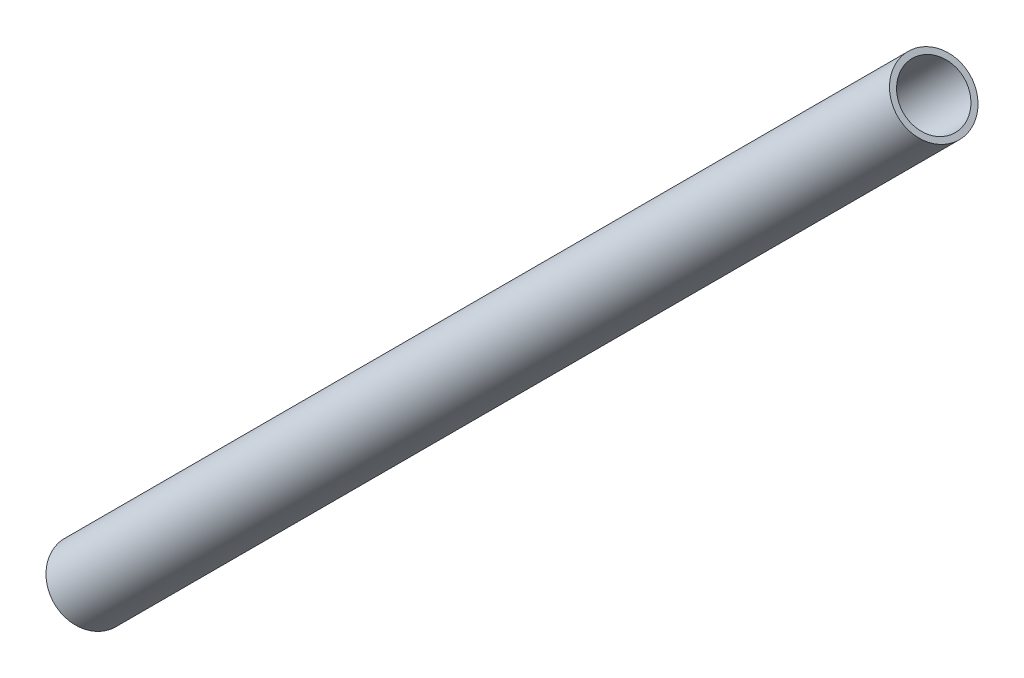
ISO-10303-21;
HEADER;
FILE_DESCRIPTION(('STEP AP214'),'2;1');
FILE_NAME('part.step','',(''),(''),'','','');
FILE_SCHEMA(('AUTOMOTIVE_DESIGN { 1 0 10303 214 1 1 1 1 }'));
ENDSEC;
DATA;
#1=APPLICATION_CONTEXT('core data for automotive mechanical design processes');
#2=APPLICATION_PROTOCOL_DEFINITION('international standard','automotive_design',2000,#1);
#3=PRODUCT_CONTEXT('',#1,'mechanical');
#4=PRODUCT('Part','Part','',(#3));
#5=PRODUCT_RELATED_PRODUCT_CATEGORY('part','',(#4));
#6=PRODUCT_DEFINITION_FORMATION('','',#4);
#7=PRODUCT_DEFINITION_CONTEXT('part definition',#1,'design');
#8=PRODUCT_DEFINITION('design','',#6,#7);
#9=PRODUCT_DEFINITION_SHAPE('','',#8);
#10=(LENGTH_UNIT() NAMED_UNIT(*) SI_UNIT(.MILLI.,.METRE.));
#11=(NAMED_UNIT(*) PLANE_ANGLE_UNIT() SI_UNIT($,.RADIAN.));
#12=(NAMED_UNIT(*) SI_UNIT($,.STERADIAN.) SOLID_ANGLE_UNIT());
#13=UNCERTAINTY_MEASURE_WITH_UNIT(LENGTH_MEASURE(1.E-05),#10,'distance_accuracy_value','');
#14=(GEOMETRIC_REPRESENTATION_CONTEXT(3) GLOBAL_UNCERTAINTY_ASSIGNED_CONTEXT((#13)) GLOBAL_UNIT_ASSIGNED_CONTEXT((#10,
#11,#12)) REPRESENTATION_CONTEXT('',''));
#15=CARTESIAN_POINT('',(0.,0.,0.));
#16=DIRECTION('',(0.,0.,1.));
#17=DIRECTION('',(1.,0.,0.));
#18=AXIS2_PLACEMENT_3D('',#15,#16,#17);
#19=CARTESIAN_POINT('',(5.37970563930204,-49.0063293202267,-9.99999999999968));
#20=DIRECTION('',(-0.707106781186544,-0.707106781186551,0.));
#21=DIRECTION('',(0.707106781186551,-0.707106781186544,0.));
#22=AXIS2_PLACEMENT_3D('',#19,#20,#21);
#23=PLANE('',#22);
#24=CARTESIAN_POINT('',(5.37970563930204,-49.0063293202267,-9.99999999999968));
#25=DIRECTION('',(-0.707106781186544,-0.707106781186551,0.));
#26=DIRECTION('',(0.707106781186551,-0.707106781186544,0.));
#27=AXIS2_PLACEMENT_3D('',#24,#25,#26);
#28=CIRCLE('',#27,5.);
#29=CARTESIAN_POINT('',(8.91523954523479,-52.5418632261594,-9.99999999999968));
#30=VERTEX_POINT('',#29);
#31=EDGE_CURVE('E10',#30,#30,#28,.T.);
#32=ORIENTED_EDGE('',*,*,#31,.T.);
#33=EDGE_LOOP('',(#32));
#34=FACE_BOUND('',#33,.T.);
#35=CARTESIAN_POINT('',(5.37970563930204,-49.0063293202267,-9.99999999999968));
#36=DIRECTION('',(-0.707106781186544,-0.707106781186551,0.));
#37=DIRECTION('',(0.707106781186551,-0.707106781186544,0.));
#38=AXIS2_PLACEMENT_3D('',#35,#36,#37);
#39=CIRCLE('',#38,4.2);
#40=CARTESIAN_POINT('',(8.34955412028556,-51.9761778012102,-9.99999999999968));
#41=VERTEX_POINT('',#40);
#42=EDGE_CURVE('E44',#41,#41,#39,.T.);
#43=ORIENTED_EDGE('',*,*,#42,.F.);
#44=EDGE_LOOP('',(#43));
#45=FACE_BOUND('',#44,.T.);
#46=ADVANCED_FACE('F33',(#34,#45),#23,.T.);
#47=CARTESIAN_POINT('',(122.052324535082,67.6662895755543,-9.99999999999967));
#48=DIRECTION('',(-0.707106781186544,-0.707106781186551,0.));
#49=DIRECTION('',(0.707106781186551,-0.707106781186544,0.));
#50=AXIS2_PLACEMENT_3D('',#47,#48,#49);
#51=PLANE('',#50);
#52=CARTESIAN_POINT('',(122.052324535082,67.6662895755543,-9.99999999999967));
#53=DIRECTION('',(-0.707106781186544,-0.707106781186551,0.));
#54=DIRECTION('',(0.707106781186551,-0.707106781186544,0.));
#55=AXIS2_PLACEMENT_3D('',#52,#53,#54);
#56=CIRCLE('',#55,5.);
#57=CARTESIAN_POINT('',(125.587858441015,64.1307556696215,-9.99999999999967));
#58=VERTEX_POINT('',#57);
#59=EDGE_CURVE('E37',#58,#58,#56,.T.);
#60=ORIENTED_EDGE('',*,*,#59,.F.);
#61=EDGE_LOOP('',(#60));
#62=FACE_BOUND('',#61,.T.);
#63=CARTESIAN_POINT('',(122.052324535082,67.6662895755543,-9.99999999999967));
#64=DIRECTION('',(-0.707106781186544,-0.707106781186551,0.));
#65=DIRECTION('',(0.707106781186551,-0.707106781186544,0.));
#66=AXIS2_PLACEMENT_3D('',#63,#64,#65);
#67=CIRCLE('',#66,4.2);
#68=CARTESIAN_POINT('',(125.022173016065,64.6964410945708,-9.99999999999967));
#69=VERTEX_POINT('',#68);
#70=EDGE_CURVE('E46',#69,#69,#67,.T.);
#71=ORIENTED_EDGE('',*,*,#70,.T.);
#72=EDGE_LOOP('',(#71));
#73=FACE_BOUND('',#72,.T.);
#74=ADVANCED_FACE('F56',(#62,#73),#51,.F.);
#75=CARTESIAN_POINT('',(5.37970563930204,-49.0063293202267,-9.99999999999968));
#76=DIRECTION('',(0.707106781186544,0.707106781186551,0.));
#77=DIRECTION('',(-0.707106781186551,0.707106781186544,0.));
#78=AXIS2_PLACEMENT_3D('',#75,#76,#77);
#79=CYLINDRICAL_SURFACE('',#78,5.);
#80=ORIENTED_EDGE('',*,*,#31,.F.);
#81=EDGE_LOOP('',(#80));
#82=FACE_BOUND('',#81,.T.);
#83=ORIENTED_EDGE('',*,*,#59,.T.);
#84=EDGE_LOOP('',(#83));
#85=FACE_BOUND('',#84,.T.);
#86=ADVANCED_FACE('F35',(#82,#85),#79,.T.);
#87=CARTESIAN_POINT('',(5.37970563930204,-49.0063293202267,-9.99999999999968));
#88=DIRECTION('',(0.707106781186544,0.707106781186551,0.));
#89=DIRECTION('',(-0.707106781186551,0.707106781186544,0.));
#90=AXIS2_PLACEMENT_3D('',#87,#88,#89);
#91=CYLINDRICAL_SURFACE('',#90,4.2);
#92=ORIENTED_EDGE('',*,*,#42,.T.);
#93=EDGE_LOOP('',(#92));
#94=FACE_BOUND('',#93,.T.);
#95=ORIENTED_EDGE('',*,*,#70,.F.);
#96=EDGE_LOOP('',(#95));
#97=FACE_BOUND('',#96,.T.);
#98=ADVANCED_FACE('F52',(#94,#97),#91,.F.);
#99=CLOSED_SHELL('',(#46,#74,#86,#98));
#100=MANIFOLD_SOLID_BREP('B2',#99);
#101=ADVANCED_BREP_SHAPE_REPRESENTATION('',(#18,#100),#14);
#102=SHAPE_DEFINITION_REPRESENTATION(#9,#101);
ENDSEC;
END-ISO-10303-21;
